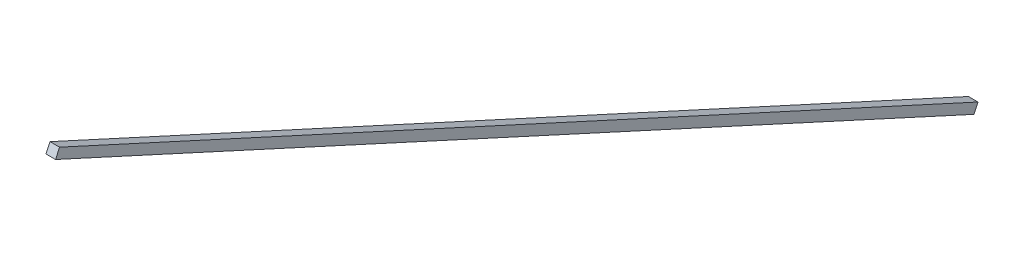
ISO-10303-21;
HEADER;
FILE_DESCRIPTION(('STEP AP214'),'2;1');
FILE_NAME('part.step','',(''),(''),'','','');
FILE_SCHEMA(('AUTOMOTIVE_DESIGN { 1 0 10303 214 1 1 1 1 }'));
ENDSEC;
DATA;
#1=APPLICATION_CONTEXT('core data for automotive mechanical design processes');
#2=APPLICATION_PROTOCOL_DEFINITION('international standard','automotive_design',2000,#1);
#3=PRODUCT_CONTEXT('',#1,'mechanical');
#4=PRODUCT('Part','Part','',(#3));
#5=PRODUCT_RELATED_PRODUCT_CATEGORY('part','',(#4));
#6=PRODUCT_DEFINITION_FORMATION('','',#4);
#7=PRODUCT_DEFINITION_CONTEXT('part definition',#1,'design');
#8=PRODUCT_DEFINITION('design','',#6,#7);
#9=PRODUCT_DEFINITION_SHAPE('','',#8);
#10=(LENGTH_UNIT() NAMED_UNIT(*) SI_UNIT(.MILLI.,.METRE.));
#11=(NAMED_UNIT(*) PLANE_ANGLE_UNIT() SI_UNIT($,.RADIAN.));
#12=(NAMED_UNIT(*) SI_UNIT($,.STERADIAN.) SOLID_ANGLE_UNIT());
#13=UNCERTAINTY_MEASURE_WITH_UNIT(LENGTH_MEASURE(1.E-05),#10,'distance_accuracy_value','');
#14=(GEOMETRIC_REPRESENTATION_CONTEXT(3) GLOBAL_UNCERTAINTY_ASSIGNED_CONTEXT((#13)) GLOBAL_UNIT_ASSIGNED_CONTEXT((#10,
#11,#12)) REPRESENTATION_CONTEXT('',''));
#15=CARTESIAN_POINT('',(0.,0.,0.));
#16=DIRECTION('',(0.,0.,1.));
#17=DIRECTION('',(1.,0.,0.));
#18=AXIS2_PLACEMENT_3D('',#15,#16,#17);
#19=CARTESIAN_POINT('',(21.600212355,23.0746571757181,211.506146719239));
#20=DIRECTION('',(5.91142491052026E-05,0.909432799384561,-0.415850910674808));
#21=DIRECTION('',(0.,0.415850911401402,0.909432800973565));
#22=AXIS2_PLACEMENT_3D('',#19,#20,#21);
#23=PLANE('',#22);
#24=DIRECTION('',(0.999999961415453,5.91142490999342E-05,0.000271430652114269));
#25=VECTOR('',#24,1.);
#26=CARTESIAN_POINT('',(21.6574842225962,-64.6698849766663,19.6158341904365));
#27=LINE('',#26,#25);
#28=CARTESIAN_POINT('',(21.6574842225962,-64.6698849766663,19.6158341904365));
#29=VERTEX_POINT('',#28);
#30=CARTESIAN_POINT('',(23.6574841454271,-64.6697667481681,19.6163770517408));
#31=VERTEX_POINT('',#30);
#32=EDGE_CURVE('E96',#29,#31,#27,.T.);
#33=ORIENTED_EDGE('',*,*,#32,.T.);
#34=DIRECTION('',(0.000271430652114805,-0.415850910674808,-0.909432760800013));
#35=VECTOR('',#34,1.);
#36=CARTESIAN_POINT('',(23.6002122778309,23.0747754042163,211.506689580544));
#37=LINE('',#36,#35);
#38=CARTESIAN_POINT('',(23.6002122778309,23.0747754042163,211.506689580544));
#39=VERTEX_POINT('',#38);
#40=EDGE_CURVE('E11',#39,#31,#37,.T.);
#41=ORIENTED_EDGE('',*,*,#40,.F.);
#42=DIRECTION('',(0.999999961415453,5.91142490999342E-05,0.000271430652114269));
#43=VECTOR('',#42,1.);
#44=CARTESIAN_POINT('',(21.600212355,23.0746571757181,211.506146719239));
#45=LINE('',#44,#43);
#46=CARTESIAN_POINT('',(21.600212355,23.0746571757181,211.506146719239));
#47=VERTEX_POINT('',#46);
#48=EDGE_CURVE('E82',#47,#39,#45,.T.);
#49=ORIENTED_EDGE('',*,*,#48,.F.);
#50=DIRECTION('',(0.000271430652114805,-0.415850910674808,-0.909432760800013));
#51=VECTOR('',#50,1.);
#52=CARTESIAN_POINT('',(21.600212355,23.0746571757181,211.506146719239));
#53=LINE('',#52,#51);
#54=EDGE_CURVE('E49',#47,#29,#53,.T.);
#55=ORIENTED_EDGE('',*,*,#54,.T.);
#56=EDGE_LOOP('',(#33,#41,#49,#55));
#57=FACE_BOUND('',#56,.T.);
#58=ADVANCED_FACE('F33',(#57),#23,.F.);
#59=CARTESIAN_POINT('',(23.6002122778309,23.0747754042163,211.506689580544));
#60=DIRECTION('',(-0.999999961415453,-5.91142491022696E-05,-0.000271430652115052));
#61=DIRECTION('',(-0.000271430652589309,0.,0.9999999631627));
#62=AXIS2_PLACEMENT_3D('',#59,#60,#61);
#63=PLANE('',#62);
#64=DIRECTION('',(5.91142491034033E-05,0.909432799384563,-0.415850910674803));
#65=VECTOR('',#64,1.);
#66=CARTESIAN_POINT('',(23.6574841454271,-64.6697667481681,19.6163770517408));
#67=LINE('',#66,#65);
#68=CARTESIAN_POINT('',(23.6576023739254,-62.850901149399,18.7846752303911));
#69=VERTEX_POINT('',#68);
#70=EDGE_CURVE('E87',#31,#69,#67,.T.);
#71=ORIENTED_EDGE('',*,*,#70,.T.);
#72=DIRECTION('',(0.000271430652114805,-0.415850910674808,-0.909432760800013));
#73=VECTOR('',#72,1.);
#74=CARTESIAN_POINT('',(23.6003305063291,24.8936410029854,210.674987759194));
#75=LINE('',#74,#73);
#76=CARTESIAN_POINT('',(23.6003305063291,24.8936410029854,210.674987759194));
#77=VERTEX_POINT('',#76);
#78=EDGE_CURVE('E41',#77,#69,#75,.T.);
#79=ORIENTED_EDGE('',*,*,#78,.F.);
#80=DIRECTION('',(5.91142491034033E-05,0.909432799384563,-0.415850910674803));
#81=VECTOR('',#80,1.);
#82=CARTESIAN_POINT('',(23.6002122778309,23.0747754042163,211.506689580544));
#83=LINE('',#82,#81);
#84=EDGE_CURVE('E74',#39,#77,#83,.T.);
#85=ORIENTED_EDGE('',*,*,#84,.F.);
#86=ORIENTED_EDGE('',*,*,#40,.T.);
#87=EDGE_LOOP('',(#71,#79,#85,#86));
#88=FACE_BOUND('',#87,.T.);
#89=ADVANCED_FACE('F86',(#88),#63,.F.);
#90=CARTESIAN_POINT('',(21.6003305834982,24.8935227744872,210.67444489789));
#91=DIRECTION('',(5.91142491052026E-05,0.909432799384561,-0.415850910674808));
#92=DIRECTION('',(0.,0.415850911401402,0.909432800973565));
#93=AXIS2_PLACEMENT_3D('',#90,#91,#92);
#94=PLANE('',#93);
#95=DIRECTION('',(0.999999961415453,5.91142490999342E-05,0.000271430652114269));
#96=VECTOR('',#95,1.);
#97=CARTESIAN_POINT('',(21.6576024510944,-62.8510193778972,18.7841323690869));
#98=LINE('',#97,#96);
#99=CARTESIAN_POINT('',(21.6576024510944,-62.8510193778972,18.7841323690869));
#100=VERTEX_POINT('',#99);
#101=EDGE_CURVE('E99',#100,#69,#98,.T.);
#102=ORIENTED_EDGE('',*,*,#101,.F.);
#103=DIRECTION('',(0.000271430652114805,-0.415850910674808,-0.909432760800013));
#104=VECTOR('',#103,1.);
#105=CARTESIAN_POINT('',(21.6003305834982,24.8935227744872,210.67444489789));
#106=LINE('',#105,#104);
#107=CARTESIAN_POINT('',(21.6003305834982,24.8935227744872,210.67444489789));
#108=VERTEX_POINT('',#107);
#109=EDGE_CURVE('E63',#108,#100,#106,.T.);
#110=ORIENTED_EDGE('',*,*,#109,.F.);
#111=DIRECTION('',(0.999999961415453,5.91142490999342E-05,0.000271430652114269));
#112=VECTOR('',#111,1.);
#113=CARTESIAN_POINT('',(21.6003305834982,24.8935227744872,210.67444489789));
#114=LINE('',#113,#112);
#115=EDGE_CURVE('E81',#108,#77,#114,.T.);
#116=ORIENTED_EDGE('',*,*,#115,.T.);
#117=ORIENTED_EDGE('',*,*,#78,.T.);
#118=EDGE_LOOP('',(#102,#110,#116,#117));
#119=FACE_BOUND('',#118,.T.);
#120=ADVANCED_FACE('F90',(#119),#94,.T.);
#121=CARTESIAN_POINT('',(21.600212355,23.0746571757181,211.506146719239));
#122=DIRECTION('',(-0.999999961415453,-5.91142491022696E-05,-0.000271430652115052));
#123=DIRECTION('',(-0.000271430652589309,0.,0.9999999631627));
#124=AXIS2_PLACEMENT_3D('',#121,#122,#123);
#125=PLANE('',#124);
#126=DIRECTION('',(5.91142491034033E-05,0.909432799384563,-0.415850910674803));
#127=VECTOR('',#126,1.);
#128=CARTESIAN_POINT('',(21.6574842225962,-64.6698849766663,19.6158341904365));
#129=LINE('',#128,#127);
#130=EDGE_CURVE('E101',#29,#100,#129,.T.);
#131=ORIENTED_EDGE('',*,*,#130,.F.);
#132=ORIENTED_EDGE('',*,*,#54,.F.);
#133=DIRECTION('',(5.91142491034033E-05,0.909432799384563,-0.415850910674803));
#134=VECTOR('',#133,1.);
#135=CARTESIAN_POINT('',(21.600212355,23.0746571757181,211.506146719239));
#136=LINE('',#135,#134);
#137=EDGE_CURVE('E91',#47,#108,#136,.T.);
#138=ORIENTED_EDGE('',*,*,#137,.T.);
#139=ORIENTED_EDGE('',*,*,#109,.T.);
#140=EDGE_LOOP('',(#131,#132,#138,#139));
#141=FACE_BOUND('',#140,.T.);
#142=ADVANCED_FACE('F107',(#141),#125,.T.);
#143=CARTESIAN_POINT('',(-0.0548128071798523,83.9770880878144,183.651191095669));
#144=DIRECTION('',(-0.000271430652113121,0.415850910674803,0.909432760800015));
#145=DIRECTION('',(0.,-0.909432794301064,0.415850925993629));
#146=AXIS2_PLACEMENT_3D('',#143,#144,#145);
#147=PLANE('',#146);
#148=ORIENTED_EDGE('',*,*,#48,.T.);
#149=ORIENTED_EDGE('',*,*,#84,.T.);
#150=ORIENTED_EDGE('',*,*,#115,.F.);
#151=ORIENTED_EDGE('',*,*,#137,.F.);
#152=EDGE_LOOP('',(#148,#149,#150,#151));
#153=FACE_BOUND('',#152,.T.);
#154=ADVANCED_FACE('F78',(#153),#147,.T.);
#155=CARTESIAN_POINT('',(0.00245906041637155,-3.76745406457002,-8.2391214331342));
#156=DIRECTION('',(-0.000271430652113121,0.415850910674803,0.909432760800015));
#157=DIRECTION('',(0.,-0.909432794301064,0.415850925993629));
#158=AXIS2_PLACEMENT_3D('',#155,#156,#157);
#159=PLANE('',#158);
#160=ORIENTED_EDGE('',*,*,#32,.F.);
#161=ORIENTED_EDGE('',*,*,#130,.T.);
#162=ORIENTED_EDGE('',*,*,#101,.T.);
#163=ORIENTED_EDGE('',*,*,#70,.F.);
#164=EDGE_LOOP('',(#160,#161,#162,#163));
#165=FACE_BOUND('',#164,.T.);
#166=ADVANCED_FACE('F106',(#165),#159,.F.);
#167=CLOSED_SHELL('',(#58,#89,#120,#142,#154,#166));
#168=MANIFOLD_SOLID_BREP('B2',#167);
#169=ADVANCED_BREP_SHAPE_REPRESENTATION('',(#18,#168),#14);
#170=SHAPE_DEFINITION_REPRESENTATION(#9,#169);
ENDSEC;
END-ISO-10303-21;
